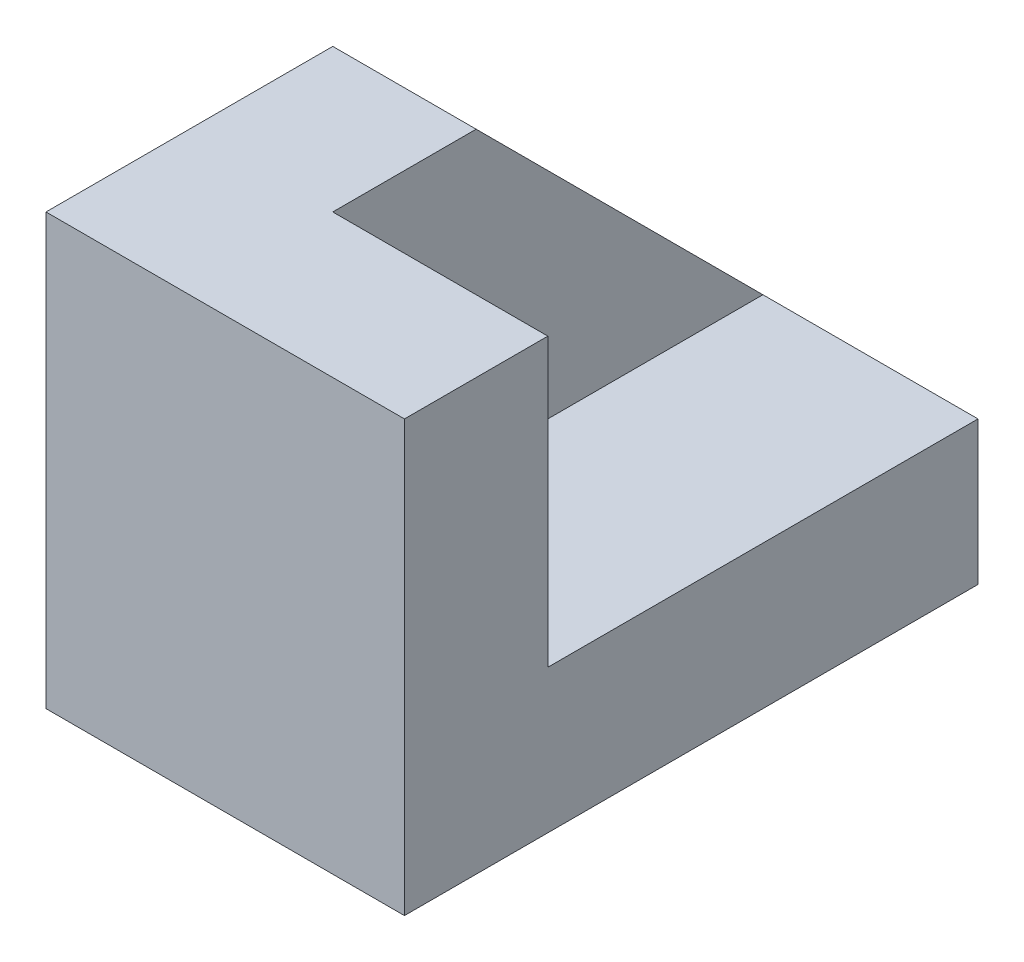
ISO-10303-21;
HEADER;
FILE_DESCRIPTION(('STEP AP214'),'2;1');
FILE_NAME('part.step','',(''),(''),'','','');
FILE_SCHEMA(('AUTOMOTIVE_DESIGN { 1 0 10303 214 1 1 1 1 }'));
ENDSEC;
DATA;
#1=APPLICATION_CONTEXT('core data for automotive mechanical design processes');
#2=APPLICATION_PROTOCOL_DEFINITION('international standard','automotive_design',2000,#1);
#3=PRODUCT_CONTEXT('',#1,'mechanical');
#4=PRODUCT('Part','Part','',(#3));
#5=PRODUCT_RELATED_PRODUCT_CATEGORY('part','',(#4));
#6=PRODUCT_DEFINITION_FORMATION('','',#4);
#7=PRODUCT_DEFINITION_CONTEXT('part definition',#1,'design');
#8=PRODUCT_DEFINITION('design','',#6,#7);
#9=PRODUCT_DEFINITION_SHAPE('','',#8);
#10=(LENGTH_UNIT() NAMED_UNIT(*) SI_UNIT(.MILLI.,.METRE.));
#11=(NAMED_UNIT(*) PLANE_ANGLE_UNIT() SI_UNIT($,.RADIAN.));
#12=(NAMED_UNIT(*) SI_UNIT($,.STERADIAN.) SOLID_ANGLE_UNIT());
#13=UNCERTAINTY_MEASURE_WITH_UNIT(LENGTH_MEASURE(1.E-05),#10,'distance_accuracy_value','');
#14=(GEOMETRIC_REPRESENTATION_CONTEXT(3) GLOBAL_UNCERTAINTY_ASSIGNED_CONTEXT((#13)) GLOBAL_UNIT_ASSIGNED_CONTEXT((#10,
#11,#12)) REPRESENTATION_CONTEXT('',''));
#15=CARTESIAN_POINT('',(0.,0.,0.));
#16=DIRECTION('',(0.,0.,1.));
#17=DIRECTION('',(1.,0.,0.));
#18=AXIS2_PLACEMENT_3D('',#15,#16,#17);
#19=CARTESIAN_POINT('',(5.,-3.,4.));
#20=DIRECTION('',(0.,0.,-1.));
#21=DIRECTION('',(-1.,0.,0.));
#22=AXIS2_PLACEMENT_3D('',#19,#20,#21);
#23=PLANE('',#22);
#24=DIRECTION('',(0.,-1.,0.));
#25=VECTOR('',#24,1.);
#26=CARTESIAN_POINT('',(0.,-3.,4.));
#27=LINE('',#26,#25);
#28=CARTESIAN_POINT('',(0.,3.,4.));
#29=VERTEX_POINT('',#28);
#30=CARTESIAN_POINT('',(0.,-3.,4.));
#31=VERTEX_POINT('',#30);
#32=EDGE_CURVE('E141',#29,#31,#27,.T.);
#33=ORIENTED_EDGE('',*,*,#32,.T.);
#34=DIRECTION('',(-1.,0.,0.));
#35=VECTOR('',#34,1.);
#36=CARTESIAN_POINT('',(5.,-3.,4.));
#37=LINE('',#36,#35);
#38=CARTESIAN_POINT('',(5.,-3.,4.));
#39=VERTEX_POINT('',#38);
#40=EDGE_CURVE('E11',#39,#31,#37,.T.);
#41=ORIENTED_EDGE('',*,*,#40,.F.);
#42=DIRECTION('',(0.,-1.,0.));
#43=VECTOR('',#42,1.);
#44=CARTESIAN_POINT('',(5.,-3.,4.));
#45=LINE('',#44,#43);
#46=CARTESIAN_POINT('',(5.,3.,4.));
#47=VERTEX_POINT('',#46);
#48=EDGE_CURVE('E133',#47,#39,#45,.T.);
#49=ORIENTED_EDGE('',*,*,#48,.F.);
#50=DIRECTION('',(-1.,0.,0.));
#51=VECTOR('',#50,1.);
#52=CARTESIAN_POINT('',(5.,3.,4.));
#53=LINE('',#52,#51);
#54=EDGE_CURVE('E130',#47,#29,#53,.T.);
#55=ORIENTED_EDGE('',*,*,#54,.T.);
#56=EDGE_LOOP('',(#33,#41,#49,#55));
#57=FACE_BOUND('',#56,.T.);
#58=ADVANCED_FACE('F37',(#57),#23,.F.);
#59=CARTESIAN_POINT('',(5.,-3.,4.));
#60=DIRECTION('',(0.,1.,0.));
#61=DIRECTION('',(0.,0.,1.));
#62=AXIS2_PLACEMENT_3D('',#59,#60,#61);
#63=PLANE('',#62);
#64=DIRECTION('',(0.,0.,-1.));
#65=VECTOR('',#64,1.);
#66=CARTESIAN_POINT('',(0.,-3.,4.));
#67=LINE('',#66,#65);
#68=CARTESIAN_POINT('',(0.,-3.,-4.));
#69=VERTEX_POINT('',#68);
#70=EDGE_CURVE('E139',#31,#69,#67,.T.);
#71=ORIENTED_EDGE('',*,*,#70,.T.);
#72=DIRECTION('',(-1.,0.,0.));
#73=VECTOR('',#72,1.);
#74=CARTESIAN_POINT('',(5.,-3.,-4.));
#75=LINE('',#74,#73);
#76=CARTESIAN_POINT('',(5.,-3.,-4.));
#77=VERTEX_POINT('',#76);
#78=EDGE_CURVE('E44',#77,#69,#75,.T.);
#79=ORIENTED_EDGE('',*,*,#78,.F.);
#80=DIRECTION('',(0.,0.,-1.));
#81=VECTOR('',#80,1.);
#82=CARTESIAN_POINT('',(5.,-3.,4.));
#83=LINE('',#82,#81);
#84=EDGE_CURVE('E88',#39,#77,#83,.T.);
#85=ORIENTED_EDGE('',*,*,#84,.F.);
#86=ORIENTED_EDGE('',*,*,#40,.T.);
#87=EDGE_LOOP('',(#71,#79,#85,#86));
#88=FACE_BOUND('',#87,.T.);
#89=ADVANCED_FACE('F168',(#88),#63,.F.);
#90=CARTESIAN_POINT('',(5.,-3.,-4.));
#91=DIRECTION('',(0.,0.,1.));
#92=DIRECTION('',(1.,0.,0.));
#93=AXIS2_PLACEMENT_3D('',#90,#91,#92);
#94=PLANE('',#93);
#95=DIRECTION('',(0.,1.,0.));
#96=VECTOR('',#95,1.);
#97=CARTESIAN_POINT('',(0.,-3.,-4.));
#98=LINE('',#97,#96);
#99=CARTESIAN_POINT('',(0.,-1.,-4.));
#100=VERTEX_POINT('',#99);
#101=EDGE_CURVE('E137',#69,#100,#98,.T.);
#102=ORIENTED_EDGE('',*,*,#101,.T.);
#103=DIRECTION('',(-1.,0.,0.));
#104=VECTOR('',#103,1.);
#105=CARTESIAN_POINT('',(5.,-1.,-4.));
#106=LINE('',#105,#104);
#107=CARTESIAN_POINT('',(2.,-1.,-4.));
#108=VERTEX_POINT('',#107);
#109=EDGE_CURVE('E125',#108,#100,#106,.T.);
#110=ORIENTED_EDGE('',*,*,#109,.F.);
#111=CARTESIAN_POINT('',(5.,-1.,-4.));
#112=VERTEX_POINT('',#111);
#113=EDGE_CURVE('E111',#112,#108,#106,.T.);
#114=ORIENTED_EDGE('',*,*,#113,.F.);
#115=DIRECTION('',(0.,1.,0.));
#116=VECTOR('',#115,1.);
#117=CARTESIAN_POINT('',(5.,-3.,-4.));
#118=LINE('',#117,#116);
#119=EDGE_CURVE('E117',#77,#112,#118,.T.);
#120=ORIENTED_EDGE('',*,*,#119,.F.);
#121=ORIENTED_EDGE('',*,*,#78,.T.);
#122=EDGE_LOOP('',(#102,#110,#114,#120,#121));
#123=FACE_BOUND('',#122,.T.);
#124=ADVANCED_FACE('F124',(#123),#94,.F.);
#125=CARTESIAN_POINT('',(5.,3.,0.));
#126=DIRECTION('',(0.,-0.707106781186548,0.707106781186548));
#127=DIRECTION('',(0.,-0.707106781186548,-0.707106781186548));
#128=AXIS2_PLACEMENT_3D('',#125,#126,#127);
#129=PLANE('',#128);
#130=DIRECTION('',(-1.,0.,0.));
#131=VECTOR('',#130,1.);
#132=CARTESIAN_POINT('',(5.,3.,0.));
#133=LINE('',#132,#131);
#134=CARTESIAN_POINT('',(2.,3.,0.));
#135=VERTEX_POINT('',#134);
#136=CARTESIAN_POINT('',(0.,3.,0.));
#137=VERTEX_POINT('',#136);
#138=EDGE_CURVE('E127',#135,#137,#133,.T.);
#139=ORIENTED_EDGE('',*,*,#138,.F.);
#140=DIRECTION('',(0.,-0.707106781186548,-0.707106781186548));
#141=VECTOR('',#140,1.);
#142=CARTESIAN_POINT('',(2.,3.,0.));
#143=LINE('',#142,#141);
#144=EDGE_CURVE('E144',#135,#108,#143,.T.);
#145=ORIENTED_EDGE('',*,*,#144,.T.);
#146=ORIENTED_EDGE('',*,*,#109,.T.);
#147=DIRECTION('',(0.,0.707106781186548,0.707106781186548));
#148=VECTOR('',#147,1.);
#149=CARTESIAN_POINT('',(0.,3.,0.));
#150=LINE('',#149,#148);
#151=EDGE_CURVE('E134',#100,#137,#150,.T.);
#152=ORIENTED_EDGE('',*,*,#151,.T.);
#153=EDGE_LOOP('',(#139,#145,#146,#152));
#154=FACE_BOUND('',#153,.T.);
#155=ADVANCED_FACE('F175',(#154),#129,.F.);
#156=CARTESIAN_POINT('',(5.,3.,4.));
#157=DIRECTION('',(0.,-1.,0.));
#158=DIRECTION('',(0.,0.,-1.));
#159=AXIS2_PLACEMENT_3D('',#156,#157,#158);
#160=PLANE('',#159);
#161=DIRECTION('',(0.,0.,1.));
#162=VECTOR('',#161,1.);
#163=CARTESIAN_POINT('',(5.,3.,4.));
#164=LINE('',#163,#162);
#165=CARTESIAN_POINT('',(5.,3.,2.));
#166=VERTEX_POINT('',#165);
#167=EDGE_CURVE('E60',#166,#47,#164,.T.);
#168=ORIENTED_EDGE('',*,*,#167,.F.);
#169=DIRECTION('',(1.,0.,0.));
#170=VECTOR('',#169,1.);
#171=CARTESIAN_POINT('',(5.,3.,2.));
#172=LINE('',#171,#170);
#173=CARTESIAN_POINT('',(2.,3.,2.));
#174=VERTEX_POINT('',#173);
#175=EDGE_CURVE('E114',#174,#166,#172,.T.);
#176=ORIENTED_EDGE('',*,*,#175,.F.);
#177=DIRECTION('',(0.,0.,1.));
#178=VECTOR('',#177,1.);
#179=CARTESIAN_POINT('',(2.,3.,2.));
#180=LINE('',#179,#178);
#181=EDGE_CURVE('E155',#135,#174,#180,.T.);
#182=ORIENTED_EDGE('',*,*,#181,.F.);
#183=ORIENTED_EDGE('',*,*,#138,.T.);
#184=DIRECTION('',(0.,0.,1.));
#185=VECTOR('',#184,1.);
#186=CARTESIAN_POINT('',(0.,3.,4.));
#187=LINE('',#186,#185);
#188=EDGE_CURVE('E83',#137,#29,#187,.T.);
#189=ORIENTED_EDGE('',*,*,#188,.T.);
#190=ORIENTED_EDGE('',*,*,#54,.F.);
#191=EDGE_LOOP('',(#168,#176,#182,#183,#189,#190));
#192=FACE_BOUND('',#191,.T.);
#193=ADVANCED_FACE('F162',(#192),#160,.F.);
#194=CARTESIAN_POINT('',(5.,0.,0.));
#195=DIRECTION('',(-1.,0.,0.));
#196=DIRECTION('',(0.,0.,1.));
#197=AXIS2_PLACEMENT_3D('',#194,#195,#196);
#198=PLANE('',#197);
#199=DIRECTION('',(0.,0.,-1.));
#200=VECTOR('',#199,1.);
#201=CARTESIAN_POINT('',(5.,-1.,2.));
#202=LINE('',#201,#200);
#203=CARTESIAN_POINT('',(5.,-1.,2.));
#204=VERTEX_POINT('',#203);
#205=EDGE_CURVE('E107',#204,#112,#202,.T.);
#206=ORIENTED_EDGE('',*,*,#205,.F.);
#207=DIRECTION('',(0.,1.,0.));
#208=VECTOR('',#207,1.);
#209=CARTESIAN_POINT('',(5.,-1.,2.));
#210=LINE('',#209,#208);
#211=EDGE_CURVE('E149',#204,#166,#210,.T.);
#212=ORIENTED_EDGE('',*,*,#211,.T.);
#213=ORIENTED_EDGE('',*,*,#167,.T.);
#214=ORIENTED_EDGE('',*,*,#48,.T.);
#215=ORIENTED_EDGE('',*,*,#84,.T.);
#216=ORIENTED_EDGE('',*,*,#119,.T.);
#217=EDGE_LOOP('',(#206,#212,#213,#214,#215,#216));
#218=FACE_BOUND('',#217,.T.);
#219=ADVANCED_FACE('F118',(#218),#198,.F.);
#220=CARTESIAN_POINT('',(0.,0.,0.));
#221=DIRECTION('',(-1.,0.,0.));
#222=DIRECTION('',(0.,0.,1.));
#223=AXIS2_PLACEMENT_3D('',#220,#221,#222);
#224=PLANE('',#223);
#225=ORIENTED_EDGE('',*,*,#32,.F.);
#226=ORIENTED_EDGE('',*,*,#188,.F.);
#227=ORIENTED_EDGE('',*,*,#151,.F.);
#228=ORIENTED_EDGE('',*,*,#101,.F.);
#229=ORIENTED_EDGE('',*,*,#70,.F.);
#230=EDGE_LOOP('',(#225,#226,#227,#228,#229));
#231=FACE_BOUND('',#230,.T.);
#232=ADVANCED_FACE('F172',(#231),#224,.T.);
#233=CARTESIAN_POINT('',(2.,-1.,2.));
#234=DIRECTION('',(-1.,0.,0.));
#235=DIRECTION('',(0.,0.,1.));
#236=AXIS2_PLACEMENT_3D('',#233,#234,#235);
#237=PLANE('',#236);
#238=ORIENTED_EDGE('',*,*,#181,.T.);
#239=DIRECTION('',(0.,1.,0.));
#240=VECTOR('',#239,1.);
#241=CARTESIAN_POINT('',(2.,-1.,2.));
#242=LINE('',#241,#240);
#243=CARTESIAN_POINT('',(2.,-1.,2.));
#244=VERTEX_POINT('',#243);
#245=EDGE_CURVE('E150',#244,#174,#242,.T.);
#246=ORIENTED_EDGE('',*,*,#245,.F.);
#247=DIRECTION('',(0.,0.,1.));
#248=VECTOR('',#247,1.);
#249=CARTESIAN_POINT('',(2.,-1.,2.));
#250=LINE('',#249,#248);
#251=EDGE_CURVE('E113',#108,#244,#250,.T.);
#252=ORIENTED_EDGE('',*,*,#251,.F.);
#253=ORIENTED_EDGE('',*,*,#144,.F.);
#254=EDGE_LOOP('',(#238,#246,#252,#253));
#255=FACE_BOUND('',#254,.T.);
#256=ADVANCED_FACE('F176',(#255),#237,.F.);
#257=CARTESIAN_POINT('',(5.,-1.,2.));
#258=DIRECTION('',(0.,0.,1.));
#259=DIRECTION('',(1.,0.,0.));
#260=AXIS2_PLACEMENT_3D('',#257,#258,#259);
#261=PLANE('',#260);
#262=ORIENTED_EDGE('',*,*,#175,.T.);
#263=ORIENTED_EDGE('',*,*,#211,.F.);
#264=DIRECTION('',(1.,0.,0.));
#265=VECTOR('',#264,1.);
#266=CARTESIAN_POINT('',(5.,-1.,2.));
#267=LINE('',#266,#265);
#268=EDGE_CURVE('E51',#244,#204,#267,.T.);
#269=ORIENTED_EDGE('',*,*,#268,.F.);
#270=ORIENTED_EDGE('',*,*,#245,.T.);
#271=EDGE_LOOP('',(#262,#263,#269,#270));
#272=FACE_BOUND('',#271,.T.);
#273=ADVANCED_FACE('F160',(#272),#261,.F.);
#274=CARTESIAN_POINT('',(0.,-1.,0.));
#275=DIRECTION('',(0.,1.,0.));
#276=DIRECTION('',(0.,0.,1.));
#277=AXIS2_PLACEMENT_3D('',#274,#275,#276);
#278=PLANE('',#277);
#279=ORIENTED_EDGE('',*,*,#205,.T.);
#280=ORIENTED_EDGE('',*,*,#113,.T.);
#281=ORIENTED_EDGE('',*,*,#251,.T.);
#282=ORIENTED_EDGE('',*,*,#268,.T.);
#283=EDGE_LOOP('',(#279,#280,#281,#282));
#284=FACE_BOUND('',#283,.T.);
#285=ADVANCED_FACE('F109',(#284),#278,.T.);
#286=CLOSED_SHELL('',(#58,#89,#124,#155,#193,#219,#232,#256,#273,#285));
#287=MANIFOLD_SOLID_BREP('B2',#286);
#288=ADVANCED_BREP_SHAPE_REPRESENTATION('',(#18,#287),#14);
#289=SHAPE_DEFINITION_REPRESENTATION(#9,#288);
ENDSEC;
END-ISO-10303-21;
